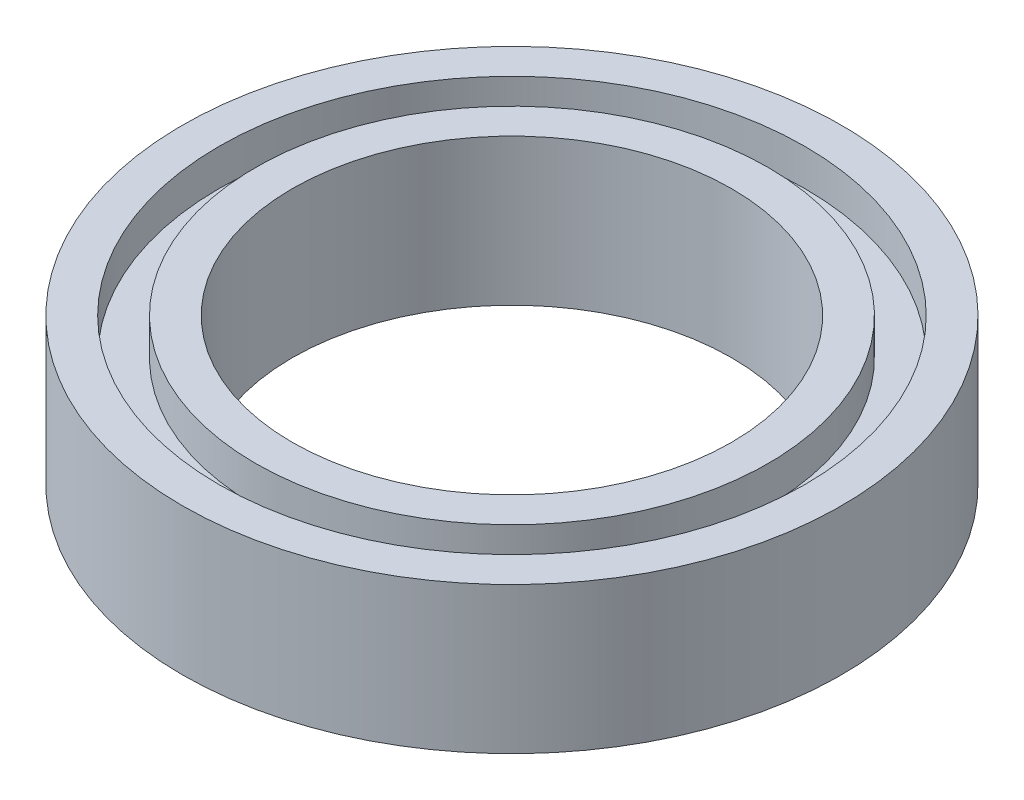
ISO-10303-21;
HEADER;
FILE_DESCRIPTION(('STEP AP214'),'2;1');
FILE_NAME('part.step','',(''),(''),'','','');
FILE_SCHEMA(('AUTOMOTIVE_DESIGN { 1 0 10303 214 1 1 1 1 }'));
ENDSEC;
DATA;
#1=APPLICATION_CONTEXT('core data for automotive mechanical design processes');
#2=APPLICATION_PROTOCOL_DEFINITION('international standard','automotive_design',2000,#1);
#3=PRODUCT_CONTEXT('',#1,'mechanical');
#4=PRODUCT('Part','Part','',(#3));
#5=PRODUCT_RELATED_PRODUCT_CATEGORY('part','',(#4));
#6=PRODUCT_DEFINITION_FORMATION('','',#4);
#7=PRODUCT_DEFINITION_CONTEXT('part definition',#1,'design');
#8=PRODUCT_DEFINITION('design','',#6,#7);
#9=PRODUCT_DEFINITION_SHAPE('','',#8);
#10=(LENGTH_UNIT() NAMED_UNIT(*) SI_UNIT(.MILLI.,.METRE.));
#11=(NAMED_UNIT(*) PLANE_ANGLE_UNIT() SI_UNIT($,.RADIAN.));
#12=(NAMED_UNIT(*) SI_UNIT($,.STERADIAN.) SOLID_ANGLE_UNIT());
#13=UNCERTAINTY_MEASURE_WITH_UNIT(LENGTH_MEASURE(1.E-05),#10,'distance_accuracy_value','');
#14=(GEOMETRIC_REPRESENTATION_CONTEXT(3) GLOBAL_UNCERTAINTY_ASSIGNED_CONTEXT((#13)) GLOBAL_UNIT_ASSIGNED_CONTEXT((#10,
#11,#12)) REPRESENTATION_CONTEXT('',''));
#15=CARTESIAN_POINT('',(0.,0.,0.));
#16=DIRECTION('',(0.,0.,1.));
#17=DIRECTION('',(1.,0.,0.));
#18=AXIS2_PLACEMENT_3D('',#15,#16,#17);
#19=CARTESIAN_POINT('',(0.,0.,0.));
#20=DIRECTION('',(0.,1.,0.));
#21=DIRECTION('',(0.,0.,1.));
#22=AXIS2_PLACEMENT_3D('',#19,#20,#21);
#23=PLANE('',#22);
#24=CARTESIAN_POINT('',(0.,0.,0.));
#25=DIRECTION('',(0.,1.,0.));
#26=DIRECTION('',(0.,0.,1.));
#27=AXIS2_PLACEMENT_3D('',#24,#25,#26);
#28=CIRCLE('',#27,6.);
#29=CARTESIAN_POINT('',(0.,0.,6.));
#30=VERTEX_POINT('',#29);
#31=EDGE_CURVE('E54',#30,#30,#28,.T.);
#32=ORIENTED_EDGE('',*,*,#31,.T.);
#33=EDGE_LOOP('',(#32));
#34=FACE_BOUND('',#33,.T.);
#35=CARTESIAN_POINT('',(0.,0.,0.));
#36=DIRECTION('',(0.,-1.,0.));
#37=DIRECTION('',(0.,0.,-1.));
#38=AXIS2_PLACEMENT_3D('',#35,#36,#37);
#39=CIRCLE('',#38,7.);
#40=CARTESIAN_POINT('',(0.,0.,-7.));
#41=VERTEX_POINT('',#40);
#42=EDGE_CURVE('E78',#41,#41,#39,.T.);
#43=ORIENTED_EDGE('',*,*,#42,.T.);
#44=EDGE_LOOP('',(#43));
#45=FACE_BOUND('',#44,.T.);
#46=ADVANCED_FACE('F41',(#34,#45),#23,.F.);
#47=CARTESIAN_POINT('',(0.,4.,0.));
#48=DIRECTION('',(0.,1.,0.));
#49=DIRECTION('',(0.,0.,1.));
#50=AXIS2_PLACEMENT_3D('',#47,#48,#49);
#51=PLANE('',#50);
#52=CARTESIAN_POINT('',(0.,4.,0.));
#53=DIRECTION('',(0.,1.,0.));
#54=DIRECTION('',(0.,0.,1.));
#55=AXIS2_PLACEMENT_3D('',#52,#53,#54);
#56=CIRCLE('',#55,6.);
#57=CARTESIAN_POINT('',(0.,4.,6.));
#58=VERTEX_POINT('',#57);
#59=EDGE_CURVE('E52',#58,#58,#56,.T.);
#60=ORIENTED_EDGE('',*,*,#59,.F.);
#61=EDGE_LOOP('',(#60));
#62=FACE_BOUND('',#61,.T.);
#63=CARTESIAN_POINT('',(0.,4.,0.));
#64=DIRECTION('',(0.,1.,0.));
#65=DIRECTION('',(0.,0.,1.));
#66=AXIS2_PLACEMENT_3D('',#63,#64,#65);
#67=CIRCLE('',#66,7.);
#68=CARTESIAN_POINT('',(0.,4.,7.));
#69=VERTEX_POINT('',#68);
#70=EDGE_CURVE('E66',#69,#69,#67,.T.);
#71=ORIENTED_EDGE('',*,*,#70,.T.);
#72=EDGE_LOOP('',(#71));
#73=FACE_BOUND('',#72,.T.);
#74=ADVANCED_FACE('F116',(#62,#73),#51,.T.);
#75=CARTESIAN_POINT('',(0.,4.,0.));
#76=DIRECTION('',(0.,1.,0.));
#77=DIRECTION('',(0.,0.,1.));
#78=AXIS2_PLACEMENT_3D('',#75,#76,#77);
#79=CIRCLE('',#78,8.);
#80=CARTESIAN_POINT('',(0.,4.,8.));
#81=VERTEX_POINT('',#80);
#82=EDGE_CURVE('E60',#81,#81,#79,.T.);
#83=ORIENTED_EDGE('',*,*,#82,.F.);
#84=EDGE_LOOP('',(#83));
#85=FACE_BOUND('',#84,.T.);
#86=CARTESIAN_POINT('',(0.,4.,0.));
#87=DIRECTION('',(0.,1.,0.));
#88=DIRECTION('',(0.,0.,1.));
#89=AXIS2_PLACEMENT_3D('',#86,#87,#88);
#90=CIRCLE('',#89,9.);
#91=CARTESIAN_POINT('',(0.,4.,9.));
#92=VERTEX_POINT('',#91);
#93=EDGE_CURVE('E10',#92,#92,#90,.T.);
#94=ORIENTED_EDGE('',*,*,#93,.T.);
#95=EDGE_LOOP('',(#94));
#96=FACE_BOUND('',#95,.T.);
#97=ADVANCED_FACE('F103',(#85,#96),#51,.T.);
#98=CARTESIAN_POINT('',(0.,0.,0.));
#99=DIRECTION('',(0.,-1.,0.));
#100=DIRECTION('',(0.,0.,-1.));
#101=AXIS2_PLACEMENT_3D('',#98,#99,#100);
#102=CIRCLE('',#101,8.);
#103=CARTESIAN_POINT('',(0.,0.,-8.));
#104=VERTEX_POINT('',#103);
#105=EDGE_CURVE('E72',#104,#104,#102,.T.);
#106=ORIENTED_EDGE('',*,*,#105,.F.);
#107=EDGE_LOOP('',(#106));
#108=FACE_BOUND('',#107,.T.);
#109=CARTESIAN_POINT('',(0.,0.,0.));
#110=DIRECTION('',(0.,1.,0.));
#111=DIRECTION('',(0.,0.,1.));
#112=AXIS2_PLACEMENT_3D('',#109,#110,#111);
#113=CIRCLE('',#112,9.);
#114=CARTESIAN_POINT('',(0.,0.,9.));
#115=VERTEX_POINT('',#114);
#116=EDGE_CURVE('E45',#115,#115,#113,.T.);
#117=ORIENTED_EDGE('',*,*,#116,.F.);
#118=EDGE_LOOP('',(#117));
#119=FACE_BOUND('',#118,.T.);
#120=ADVANCED_FACE('F100',(#108,#119),#23,.F.);
#121=CARTESIAN_POINT('',(0.,4.,0.));
#122=DIRECTION('',(0.,-1.,0.));
#123=DIRECTION('',(0.,0.,-1.));
#124=AXIS2_PLACEMENT_3D('',#121,#122,#123);
#125=CYLINDRICAL_SURFACE('',#124,9.);
#126=ORIENTED_EDGE('',*,*,#93,.F.);
#127=EDGE_LOOP('',(#126));
#128=FACE_BOUND('',#127,.T.);
#129=ORIENTED_EDGE('',*,*,#116,.T.);
#130=EDGE_LOOP('',(#129));
#131=FACE_BOUND('',#130,.T.);
#132=ADVANCED_FACE('F43',(#128,#131),#125,.T.);
#133=CARTESIAN_POINT('',(0.,4.,0.));
#134=DIRECTION('',(0.,-1.,0.));
#135=DIRECTION('',(0.,0.,-1.));
#136=AXIS2_PLACEMENT_3D('',#133,#134,#135);
#137=CYLINDRICAL_SURFACE('',#136,6.);
#138=ORIENTED_EDGE('',*,*,#59,.T.);
#139=EDGE_LOOP('',(#138));
#140=FACE_BOUND('',#139,.T.);
#141=ORIENTED_EDGE('',*,*,#31,.F.);
#142=EDGE_LOOP('',(#141));
#143=FACE_BOUND('',#142,.T.);
#144=ADVANCED_FACE('F107',(#140,#143),#137,.F.);
#145=CARTESIAN_POINT('',(0.,3.,0.));
#146=DIRECTION('',(0.,1.,0.));
#147=DIRECTION('',(0.,0.,1.));
#148=AXIS2_PLACEMENT_3D('',#145,#146,#147);
#149=CYLINDRICAL_SURFACE('',#148,8.);
#150=CARTESIAN_POINT('',(0.,3.,0.));
#151=DIRECTION('',(0.,1.,0.));
#152=DIRECTION('',(0.,0.,1.));
#153=AXIS2_PLACEMENT_3D('',#150,#151,#152);
#154=CIRCLE('',#153,8.);
#155=CARTESIAN_POINT('',(0.,3.,8.));
#156=VERTEX_POINT('',#155);
#157=EDGE_CURVE('E57',#156,#156,#154,.T.);
#158=ORIENTED_EDGE('',*,*,#157,.F.);
#159=EDGE_LOOP('',(#158));
#160=FACE_BOUND('',#159,.T.);
#161=ORIENTED_EDGE('',*,*,#82,.T.);
#162=EDGE_LOOP('',(#161));
#163=FACE_BOUND('',#162,.T.);
#164=ADVANCED_FACE('F112',(#160,#163),#149,.F.);
#165=CARTESIAN_POINT('',(0.,3.,0.));
#166=DIRECTION('',(0.,1.,0.));
#167=DIRECTION('',(0.,0.,1.));
#168=AXIS2_PLACEMENT_3D('',#165,#166,#167);
#169=PLANE('',#168);
#170=CARTESIAN_POINT('',(0.,3.,0.));
#171=DIRECTION('',(0.,1.,0.));
#172=DIRECTION('',(0.,0.,1.));
#173=AXIS2_PLACEMENT_3D('',#170,#171,#172);
#174=CIRCLE('',#173,7.);
#175=CARTESIAN_POINT('',(0.,3.,7.));
#176=VERTEX_POINT('',#175);
#177=EDGE_CURVE('E63',#176,#176,#174,.T.);
#178=ORIENTED_EDGE('',*,*,#177,.F.);
#179=EDGE_LOOP('',(#178));
#180=FACE_BOUND('',#179,.T.);
#181=ORIENTED_EDGE('',*,*,#157,.T.);
#182=EDGE_LOOP('',(#181));
#183=FACE_BOUND('',#182,.T.);
#184=ADVANCED_FACE('F130',(#180,#183),#169,.T.);
#185=CARTESIAN_POINT('',(0.,3.,0.));
#186=DIRECTION('',(0.,1.,0.));
#187=DIRECTION('',(0.,0.,1.));
#188=AXIS2_PLACEMENT_3D('',#185,#186,#187);
#189=CYLINDRICAL_SURFACE('',#188,7.);
#190=ORIENTED_EDGE('',*,*,#177,.T.);
#191=EDGE_LOOP('',(#190));
#192=FACE_BOUND('',#191,.T.);
#193=ORIENTED_EDGE('',*,*,#70,.F.);
#194=EDGE_LOOP('',(#193));
#195=FACE_BOUND('',#194,.T.);
#196=ADVANCED_FACE('F96',(#192,#195),#189,.T.);
#197=CARTESIAN_POINT('',(0.,1.,0.));
#198=DIRECTION('',(0.,-1.,0.));
#199=DIRECTION('',(0.,0.,-1.));
#200=AXIS2_PLACEMENT_3D('',#197,#198,#199);
#201=CYLINDRICAL_SURFACE('',#200,8.);
#202=CARTESIAN_POINT('',(0.,1.,0.));
#203=DIRECTION('',(0.,-1.,0.));
#204=DIRECTION('',(0.,0.,-1.));
#205=AXIS2_PLACEMENT_3D('',#202,#203,#204);
#206=CIRCLE('',#205,8.);
#207=CARTESIAN_POINT('',(0.,1.,-8.));
#208=VERTEX_POINT('',#207);
#209=EDGE_CURVE('E69',#208,#208,#206,.T.);
#210=ORIENTED_EDGE('',*,*,#209,.F.);
#211=EDGE_LOOP('',(#210));
#212=FACE_BOUND('',#211,.T.);
#213=ORIENTED_EDGE('',*,*,#105,.T.);
#214=EDGE_LOOP('',(#213));
#215=FACE_BOUND('',#214,.T.);
#216=ADVANCED_FACE('F90',(#212,#215),#201,.F.);
#217=CARTESIAN_POINT('',(0.,1.,0.));
#218=DIRECTION('',(0.,-1.,0.));
#219=DIRECTION('',(0.,0.,-1.));
#220=AXIS2_PLACEMENT_3D('',#217,#218,#219);
#221=PLANE('',#220);
#222=CARTESIAN_POINT('',(0.,1.,0.));
#223=DIRECTION('',(0.,-1.,0.));
#224=DIRECTION('',(0.,0.,-1.));
#225=AXIS2_PLACEMENT_3D('',#222,#223,#224);
#226=CIRCLE('',#225,7.);
#227=CARTESIAN_POINT('',(0.,1.,-7.));
#228=VERTEX_POINT('',#227);
#229=EDGE_CURVE('E75',#228,#228,#226,.T.);
#230=ORIENTED_EDGE('',*,*,#229,.F.);
#231=EDGE_LOOP('',(#230));
#232=FACE_BOUND('',#231,.T.);
#233=ORIENTED_EDGE('',*,*,#209,.T.);
#234=EDGE_LOOP('',(#233));
#235=FACE_BOUND('',#234,.T.);
#236=ADVANCED_FACE('F87',(#232,#235),#221,.T.);
#237=CARTESIAN_POINT('',(0.,1.,0.));
#238=DIRECTION('',(0.,-1.,0.));
#239=DIRECTION('',(0.,0.,-1.));
#240=AXIS2_PLACEMENT_3D('',#237,#238,#239);
#241=CYLINDRICAL_SURFACE('',#240,7.);
#242=ORIENTED_EDGE('',*,*,#229,.T.);
#243=EDGE_LOOP('',(#242));
#244=FACE_BOUND('',#243,.T.);
#245=ORIENTED_EDGE('',*,*,#42,.F.);
#246=EDGE_LOOP('',(#245));
#247=FACE_BOUND('',#246,.T.);
#248=ADVANCED_FACE('F84',(#244,#247),#241,.T.);
#249=CLOSED_SHELL('',(#46,#74,#97,#120,#132,#144,#164,#184,#196,#216,#236,#248));
#250=MANIFOLD_SOLID_BREP('B2',#249);
#251=ADVANCED_BREP_SHAPE_REPRESENTATION('',(#18,#250),#14);
#252=SHAPE_DEFINITION_REPRESENTATION(#9,#251);
ENDSEC;
END-ISO-10303-21;
